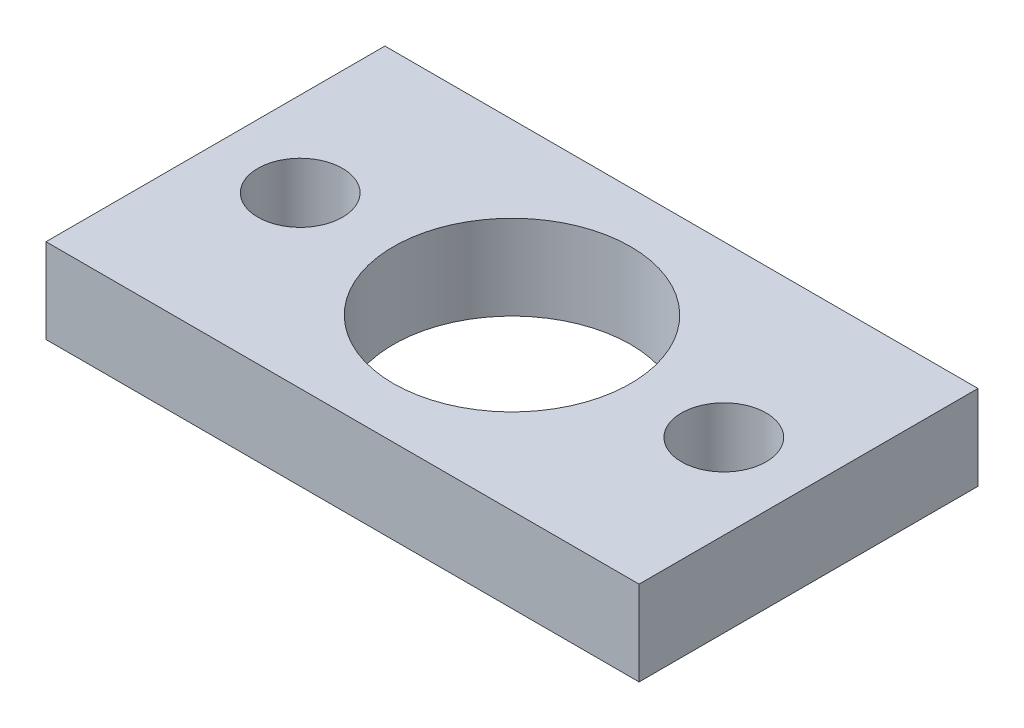
ISO-10303-21;
HEADER;
FILE_DESCRIPTION(('STEP AP214'),'2;1');
FILE_NAME('part.step','',(''),(''),'','','');
FILE_SCHEMA(('AUTOMOTIVE_DESIGN { 1 0 10303 214 1 1 1 1 }'));
ENDSEC;
DATA;
#1=APPLICATION_CONTEXT('core data for automotive mechanical design processes');
#2=APPLICATION_PROTOCOL_DEFINITION('international standard','automotive_design',2000,#1);
#3=PRODUCT_CONTEXT('',#1,'mechanical');
#4=PRODUCT('Part','Part','',(#3));
#5=PRODUCT_RELATED_PRODUCT_CATEGORY('part','',(#4));
#6=PRODUCT_DEFINITION_FORMATION('','',#4);
#7=PRODUCT_DEFINITION_CONTEXT('part definition',#1,'design');
#8=PRODUCT_DEFINITION('design','',#6,#7);
#9=PRODUCT_DEFINITION_SHAPE('','',#8);
#10=(LENGTH_UNIT() NAMED_UNIT(*) SI_UNIT(.MILLI.,.METRE.));
#11=(NAMED_UNIT(*) PLANE_ANGLE_UNIT() SI_UNIT($,.RADIAN.));
#12=(NAMED_UNIT(*) SI_UNIT($,.STERADIAN.) SOLID_ANGLE_UNIT());
#13=UNCERTAINTY_MEASURE_WITH_UNIT(LENGTH_MEASURE(1.E-05),#10,'distance_accuracy_value','');
#14=(GEOMETRIC_REPRESENTATION_CONTEXT(3) GLOBAL_UNCERTAINTY_ASSIGNED_CONTEXT((#13)) GLOBAL_UNIT_ASSIGNED_CONTEXT((#10,
#11,#12)) REPRESENTATION_CONTEXT('',''));
#15=CARTESIAN_POINT('',(0.,0.,0.));
#16=DIRECTION('',(0.,0.,1.));
#17=DIRECTION('',(1.,0.,0.));
#18=AXIS2_PLACEMENT_3D('',#15,#16,#17);
#19=CARTESIAN_POINT('',(0.,2.5,0.));
#20=DIRECTION('',(0.,-1.,0.));
#21=DIRECTION('',(0.,0.,-1.));
#22=AXIS2_PLACEMENT_3D('',#19,#20,#21);
#23=PLANE('',#22);
#24=DIRECTION('',(0.,0.,-1.));
#25=VECTOR('',#24,1.);
#26=CARTESIAN_POINT('',(17.5,2.5,10.));
#27=LINE('',#26,#25);
#28=CARTESIAN_POINT('',(17.5,2.5,10.));
#29=VERTEX_POINT('',#28);
#30=CARTESIAN_POINT('',(17.5,2.5,-10.));
#31=VERTEX_POINT('',#30);
#32=EDGE_CURVE('E92',#29,#31,#27,.T.);
#33=ORIENTED_EDGE('',*,*,#32,.T.);
#34=DIRECTION('',(-1.,0.,0.));
#35=VECTOR('',#34,1.);
#36=CARTESIAN_POINT('',(-17.5,2.5,-10.));
#37=LINE('',#36,#35);
#38=CARTESIAN_POINT('',(-17.5,2.5,-10.));
#39=VERTEX_POINT('',#38);
#40=EDGE_CURVE('E87',#31,#39,#37,.T.);
#41=ORIENTED_EDGE('',*,*,#40,.T.);
#42=DIRECTION('',(0.,0.,1.));
#43=VECTOR('',#42,1.);
#44=CARTESIAN_POINT('',(-17.5,2.5,10.));
#45=LINE('',#44,#43);
#46=CARTESIAN_POINT('',(-17.5,2.5,10.));
#47=VERTEX_POINT('',#46);
#48=EDGE_CURVE('E90',#39,#47,#45,.T.);
#49=ORIENTED_EDGE('',*,*,#48,.T.);
#50=DIRECTION('',(1.,0.,0.));
#51=VECTOR('',#50,1.);
#52=CARTESIAN_POINT('',(-17.5,2.5,10.));
#53=LINE('',#52,#51);
#54=EDGE_CURVE('E57',#47,#29,#53,.T.);
#55=ORIENTED_EDGE('',*,*,#54,.T.);
#56=EDGE_LOOP('',(#33,#41,#49,#55));
#57=FACE_BOUND('',#56,.T.);
#58=CARTESIAN_POINT('',(0.,2.5,0.));
#59=DIRECTION('',(0.,1.,0.));
#60=DIRECTION('',(0.,0.,1.));
#61=AXIS2_PLACEMENT_3D('',#58,#59,#60);
#62=CIRCLE('',#61,7.);
#63=CARTESIAN_POINT('',(0.,2.5,7.));
#64=VERTEX_POINT('',#63);
#65=EDGE_CURVE('E112',#64,#64,#62,.T.);
#66=ORIENTED_EDGE('',*,*,#65,.F.);
#67=EDGE_LOOP('',(#66));
#68=FACE_BOUND('',#67,.T.);
#69=CARTESIAN_POINT('',(12.5,2.5,0.));
#70=DIRECTION('',(0.,1.,0.));
#71=DIRECTION('',(0.,0.,1.));
#72=AXIS2_PLACEMENT_3D('',#69,#70,#71);
#73=CIRCLE('',#72,2.5);
#74=CARTESIAN_POINT('',(12.5,2.5,2.5));
#75=VERTEX_POINT('',#74);
#76=EDGE_CURVE('E134',#75,#75,#73,.T.);
#77=ORIENTED_EDGE('',*,*,#76,.F.);
#78=EDGE_LOOP('',(#77));
#79=FACE_BOUND('',#78,.T.);
#80=CARTESIAN_POINT('',(-12.5,2.5,0.));
#81=DIRECTION('',(0.,1.,0.));
#82=DIRECTION('',(0.,0.,1.));
#83=AXIS2_PLACEMENT_3D('',#80,#81,#82);
#84=CIRCLE('',#83,2.5);
#85=CARTESIAN_POINT('',(-12.5,2.5,2.5));
#86=VERTEX_POINT('',#85);
#87=EDGE_CURVE('E142',#86,#86,#84,.T.);
#88=ORIENTED_EDGE('',*,*,#87,.F.);
#89=EDGE_LOOP('',(#88));
#90=FACE_BOUND('',#89,.T.);
#91=ADVANCED_FACE('F39',(#57,#68,#79,#90),#23,.F.);
#92=CARTESIAN_POINT('',(0.,-2.5,0.));
#93=DIRECTION('',(0.,-1.,0.));
#94=DIRECTION('',(0.,0.,-1.));
#95=AXIS2_PLACEMENT_3D('',#92,#93,#94);
#96=PLANE('',#95);
#97=CARTESIAN_POINT('',(12.5,-2.5,0.));
#98=DIRECTION('',(0.,1.,0.));
#99=DIRECTION('',(0.,0.,1.));
#100=AXIS2_PLACEMENT_3D('',#97,#98,#99);
#101=CIRCLE('',#100,2.5);
#102=CARTESIAN_POINT('',(12.5,-2.5,2.5));
#103=VERTEX_POINT('',#102);
#104=EDGE_CURVE('E138',#103,#103,#101,.T.);
#105=ORIENTED_EDGE('',*,*,#104,.T.);
#106=EDGE_LOOP('',(#105));
#107=FACE_BOUND('',#106,.T.);
#108=DIRECTION('',(0.,0.,-1.));
#109=VECTOR('',#108,1.);
#110=CARTESIAN_POINT('',(17.5,-2.5,10.));
#111=LINE('',#110,#109);
#112=CARTESIAN_POINT('',(17.5,-2.5,10.));
#113=VERTEX_POINT('',#112);
#114=CARTESIAN_POINT('',(17.5,-2.5,-10.));
#115=VERTEX_POINT('',#114);
#116=EDGE_CURVE('E108',#113,#115,#111,.T.);
#117=ORIENTED_EDGE('',*,*,#116,.F.);
#118=DIRECTION('',(1.,0.,0.));
#119=VECTOR('',#118,1.);
#120=CARTESIAN_POINT('',(-17.5,-2.5,10.));
#121=LINE('',#120,#119);
#122=CARTESIAN_POINT('',(-17.5,-2.5,10.));
#123=VERTEX_POINT('',#122);
#124=EDGE_CURVE('E80',#123,#113,#121,.T.);
#125=ORIENTED_EDGE('',*,*,#124,.F.);
#126=DIRECTION('',(0.,0.,1.));
#127=VECTOR('',#126,1.);
#128=CARTESIAN_POINT('',(-17.5,-2.5,10.));
#129=LINE('',#128,#127);
#130=CARTESIAN_POINT('',(-17.5,-2.5,-10.));
#131=VERTEX_POINT('',#130);
#132=EDGE_CURVE('E74',#131,#123,#129,.T.);
#133=ORIENTED_EDGE('',*,*,#132,.F.);
#134=DIRECTION('',(-1.,0.,0.));
#135=VECTOR('',#134,1.);
#136=CARTESIAN_POINT('',(-17.5,-2.5,-10.));
#137=LINE('',#136,#135);
#138=EDGE_CURVE('E97',#115,#131,#137,.T.);
#139=ORIENTED_EDGE('',*,*,#138,.F.);
#140=EDGE_LOOP('',(#117,#125,#133,#139));
#141=FACE_BOUND('',#140,.T.);
#142=CARTESIAN_POINT('',(0.,-2.5,0.));
#143=DIRECTION('',(0.,1.,0.));
#144=DIRECTION('',(0.,0.,1.));
#145=AXIS2_PLACEMENT_3D('',#142,#143,#144);
#146=CIRCLE('',#145,7.);
#147=CARTESIAN_POINT('',(0.,-2.5,7.));
#148=VERTEX_POINT('',#147);
#149=EDGE_CURVE('E130',#148,#148,#146,.T.);
#150=ORIENTED_EDGE('',*,*,#149,.T.);
#151=EDGE_LOOP('',(#150));
#152=FACE_BOUND('',#151,.T.);
#153=CARTESIAN_POINT('',(-12.5,-2.5,0.));
#154=DIRECTION('',(0.,1.,0.));
#155=DIRECTION('',(0.,0.,1.));
#156=AXIS2_PLACEMENT_3D('',#153,#154,#155);
#157=CIRCLE('',#156,2.5);
#158=CARTESIAN_POINT('',(-12.5,-2.5,2.5));
#159=VERTEX_POINT('',#158);
#160=EDGE_CURVE('E146',#159,#159,#157,.T.);
#161=ORIENTED_EDGE('',*,*,#160,.T.);
#162=EDGE_LOOP('',(#161));
#163=FACE_BOUND('',#162,.T.);
#164=ADVANCED_FACE('F125',(#107,#141,#152,#163),#96,.T.);
#165=CARTESIAN_POINT('',(17.5,2.5,10.));
#166=DIRECTION('',(-1.,0.,0.));
#167=DIRECTION('',(0.,0.,1.));
#168=AXIS2_PLACEMENT_3D('',#165,#166,#167);
#169=PLANE('',#168);
#170=ORIENTED_EDGE('',*,*,#116,.T.);
#171=DIRECTION('',(0.,-1.,0.));
#172=VECTOR('',#171,1.);
#173=CARTESIAN_POINT('',(17.5,2.5,-10.));
#174=LINE('',#173,#172);
#175=EDGE_CURVE('E11',#31,#115,#174,.T.);
#176=ORIENTED_EDGE('',*,*,#175,.F.);
#177=ORIENTED_EDGE('',*,*,#32,.F.);
#178=DIRECTION('',(0.,-1.,0.));
#179=VECTOR('',#178,1.);
#180=CARTESIAN_POINT('',(17.5,2.5,10.));
#181=LINE('',#180,#179);
#182=EDGE_CURVE('E104',#29,#113,#181,.T.);
#183=ORIENTED_EDGE('',*,*,#182,.T.);
#184=EDGE_LOOP('',(#170,#176,#177,#183));
#185=FACE_BOUND('',#184,.T.);
#186=ADVANCED_FACE('F41',(#185),#169,.F.);
#187=CARTESIAN_POINT('',(-17.5,2.5,-10.));
#188=DIRECTION('',(0.,0.,1.));
#189=DIRECTION('',(1.,0.,0.));
#190=AXIS2_PLACEMENT_3D('',#187,#188,#189);
#191=PLANE('',#190);
#192=ORIENTED_EDGE('',*,*,#138,.T.);
#193=DIRECTION('',(0.,-1.,0.));
#194=VECTOR('',#193,1.);
#195=CARTESIAN_POINT('',(-17.5,2.5,-10.));
#196=LINE('',#195,#194);
#197=EDGE_CURVE('E49',#39,#131,#196,.T.);
#198=ORIENTED_EDGE('',*,*,#197,.F.);
#199=ORIENTED_EDGE('',*,*,#40,.F.);
#200=ORIENTED_EDGE('',*,*,#175,.T.);
#201=EDGE_LOOP('',(#192,#198,#199,#200));
#202=FACE_BOUND('',#201,.T.);
#203=ADVANCED_FACE('F96',(#202),#191,.F.);
#204=CARTESIAN_POINT('',(-17.5,2.5,10.));
#205=DIRECTION('',(1.,0.,0.));
#206=DIRECTION('',(0.,0.,-1.));
#207=AXIS2_PLACEMENT_3D('',#204,#205,#206);
#208=PLANE('',#207);
#209=ORIENTED_EDGE('',*,*,#132,.T.);
#210=DIRECTION('',(0.,-1.,0.));
#211=VECTOR('',#210,1.);
#212=CARTESIAN_POINT('',(-17.5,2.5,10.));
#213=LINE('',#212,#211);
#214=EDGE_CURVE('E99',#47,#123,#213,.T.);
#215=ORIENTED_EDGE('',*,*,#214,.F.);
#216=ORIENTED_EDGE('',*,*,#48,.F.);
#217=ORIENTED_EDGE('',*,*,#197,.T.);
#218=EDGE_LOOP('',(#209,#215,#216,#217));
#219=FACE_BOUND('',#218,.T.);
#220=ADVANCED_FACE('F100',(#219),#208,.F.);
#221=CARTESIAN_POINT('',(-17.5,2.5,10.));
#222=DIRECTION('',(0.,0.,-1.));
#223=DIRECTION('',(-1.,0.,0.));
#224=AXIS2_PLACEMENT_3D('',#221,#222,#223);
#225=PLANE('',#224);
#226=ORIENTED_EDGE('',*,*,#124,.T.);
#227=ORIENTED_EDGE('',*,*,#182,.F.);
#228=ORIENTED_EDGE('',*,*,#54,.F.);
#229=ORIENTED_EDGE('',*,*,#214,.T.);
#230=EDGE_LOOP('',(#226,#227,#228,#229));
#231=FACE_BOUND('',#230,.T.);
#232=ADVANCED_FACE('F122',(#231),#225,.F.);
#233=CARTESIAN_POINT('',(0.,2.5,0.));
#234=DIRECTION('',(0.,-1.,0.));
#235=DIRECTION('',(0.,0.,-1.));
#236=AXIS2_PLACEMENT_3D('',#233,#234,#235);
#237=CYLINDRICAL_SURFACE('',#236,7.);
#238=ORIENTED_EDGE('',*,*,#65,.T.);
#239=EDGE_LOOP('',(#238));
#240=FACE_BOUND('',#239,.T.);
#241=ORIENTED_EDGE('',*,*,#149,.F.);
#242=EDGE_LOOP('',(#241));
#243=FACE_BOUND('',#242,.T.);
#244=ADVANCED_FACE('F165',(#240,#243),#237,.F.);
#245=CARTESIAN_POINT('',(12.5,2.5,0.));
#246=DIRECTION('',(0.,-1.,0.));
#247=DIRECTION('',(0.,0.,-1.));
#248=AXIS2_PLACEMENT_3D('',#245,#246,#247);
#249=CYLINDRICAL_SURFACE('',#248,2.5);
#250=ORIENTED_EDGE('',*,*,#76,.T.);
#251=EDGE_LOOP('',(#250));
#252=FACE_BOUND('',#251,.T.);
#253=ORIENTED_EDGE('',*,*,#104,.F.);
#254=EDGE_LOOP('',(#253));
#255=FACE_BOUND('',#254,.T.);
#256=ADVANCED_FACE('F211',(#252,#255),#249,.F.);
#257=CARTESIAN_POINT('',(-12.5,2.5,0.));
#258=DIRECTION('',(0.,-1.,0.));
#259=DIRECTION('',(0.,0.,-1.));
#260=AXIS2_PLACEMENT_3D('',#257,#258,#259);
#261=CYLINDRICAL_SURFACE('',#260,2.5);
#262=ORIENTED_EDGE('',*,*,#87,.T.);
#263=EDGE_LOOP('',(#262));
#264=FACE_BOUND('',#263,.T.);
#265=ORIENTED_EDGE('',*,*,#160,.F.);
#266=EDGE_LOOP('',(#265));
#267=FACE_BOUND('',#266,.T.);
#268=ADVANCED_FACE('F154',(#264,#267),#261,.F.);
#269=CLOSED_SHELL('',(#91,#164,#186,#203,#220,#232,#244,#256,#268));
#270=MANIFOLD_SOLID_BREP('B2',#269);
#271=ADVANCED_BREP_SHAPE_REPRESENTATION('',(#18,#270),#14);
#272=SHAPE_DEFINITION_REPRESENTATION(#9,#271);
ENDSEC;
END-ISO-10303-21;
